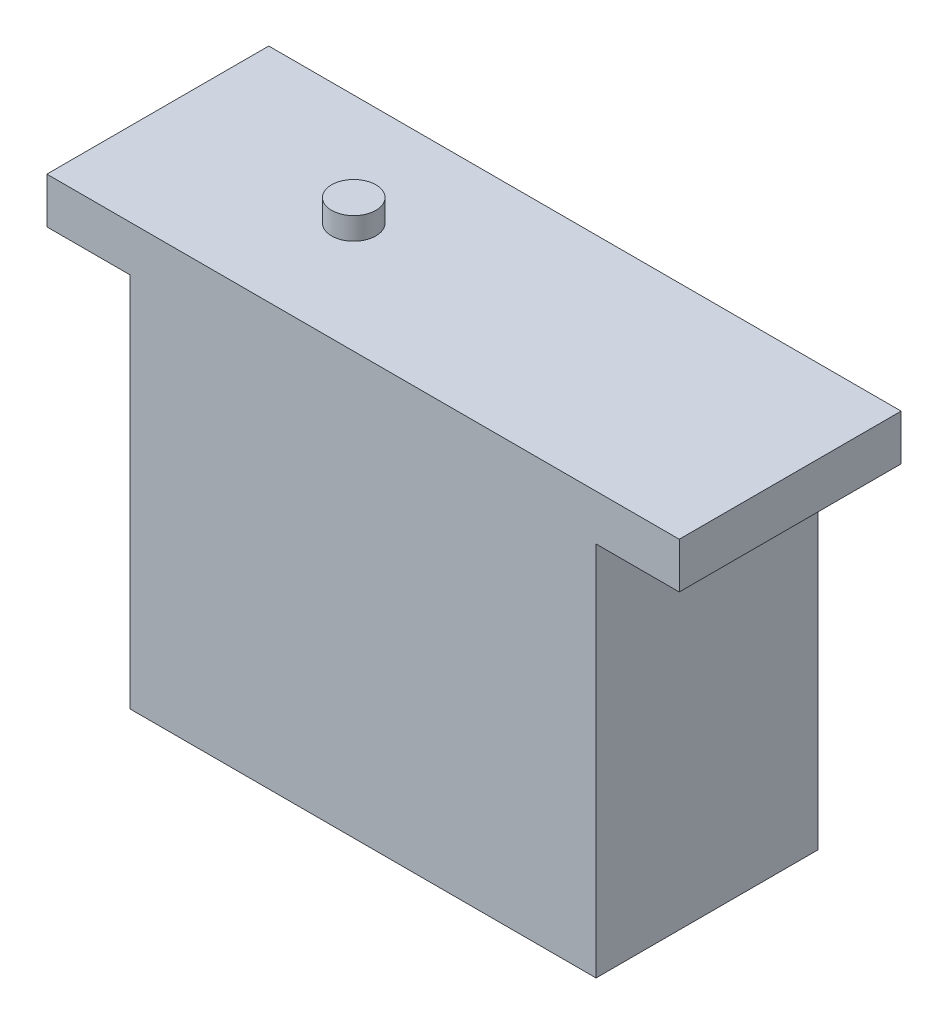
ISO-10303-21;
HEADER;
FILE_DESCRIPTION(('STEP AP214'),'2;1');
FILE_NAME('part.step','',(''),(''),'','','');
FILE_SCHEMA(('AUTOMOTIVE_DESIGN { 1 0 10303 214 1 1 1 1 }'));
ENDSEC;
DATA;
#1=APPLICATION_CONTEXT('core data for automotive mechanical design processes');
#2=APPLICATION_PROTOCOL_DEFINITION('international standard','automotive_design',2000,#1);
#3=PRODUCT_CONTEXT('',#1,'mechanical');
#4=PRODUCT('Part','Part','',(#3));
#5=PRODUCT_RELATED_PRODUCT_CATEGORY('part','',(#4));
#6=PRODUCT_DEFINITION_FORMATION('','',#4);
#7=PRODUCT_DEFINITION_CONTEXT('part definition',#1,'design');
#8=PRODUCT_DEFINITION('design','',#6,#7);
#9=PRODUCT_DEFINITION_SHAPE('','',#8);
#10=(LENGTH_UNIT() NAMED_UNIT(*) SI_UNIT(.MILLI.,.METRE.));
#11=(NAMED_UNIT(*) PLANE_ANGLE_UNIT() SI_UNIT($,.RADIAN.));
#12=(NAMED_UNIT(*) SI_UNIT($,.STERADIAN.) SOLID_ANGLE_UNIT());
#13=UNCERTAINTY_MEASURE_WITH_UNIT(LENGTH_MEASURE(1.E-05),#10,'distance_accuracy_value','');
#14=(GEOMETRIC_REPRESENTATION_CONTEXT(3) GLOBAL_UNCERTAINTY_ASSIGNED_CONTEXT((#13)) GLOBAL_UNIT_ASSIGNED_CONTEXT((#10,
#11,#12)) REPRESENTATION_CONTEXT('',''));
#15=CARTESIAN_POINT('',(0.,0.,0.));
#16=DIRECTION('',(0.,0.,1.));
#17=DIRECTION('',(1.,0.,0.));
#18=AXIS2_PLACEMENT_3D('',#15,#16,#17);
#19=CARTESIAN_POINT('',(-21.,19.,20.));
#20=DIRECTION('',(0.,1.,0.));
#21=DIRECTION('',(0.,0.,1.));
#22=AXIS2_PLACEMENT_3D('',#19,#20,#21);
#23=PLANE('',#22);
#24=CARTESIAN_POINT('',(-10.84,19.,10.));
#25=DIRECTION('',(0.,1.,0.));
#26=DIRECTION('',(0.,0.,1.));
#27=AXIS2_PLACEMENT_3D('',#24,#25,#26);
#28=CIRCLE('',#27,1.99591471340259);
#29=CARTESIAN_POINT('',(-10.84,19.,11.9959147134026));
#30=VERTEX_POINT('',#29);
#31=EDGE_CURVE('E162',#30,#30,#28,.T.);
#32=ORIENTED_EDGE('',*,*,#31,.F.);
#33=EDGE_LOOP('',(#32));
#34=FACE_BOUND('',#33,.T.);
#35=DIRECTION('',(1.,0.,0.));
#36=VECTOR('',#35,1.);
#37=CARTESIAN_POINT('',(-21.,19.,0.));
#38=LINE('',#37,#36);
#39=CARTESIAN_POINT('',(-28.5,19.,0.));
#40=VERTEX_POINT('',#39);
#41=CARTESIAN_POINT('',(28.5,19.,0.));
#42=VERTEX_POINT('',#41);
#43=EDGE_CURVE('E167',#40,#42,#38,.T.);
#44=ORIENTED_EDGE('',*,*,#43,.F.);
#45=DIRECTION('',(0.,0.,-1.));
#46=VECTOR('',#45,1.);
#47=CARTESIAN_POINT('',(-28.5,19.,20.));
#48=LINE('',#47,#46);
#49=CARTESIAN_POINT('',(-28.5,19.,20.));
#50=VERTEX_POINT('',#49);
#51=EDGE_CURVE('E142',#50,#40,#48,.T.);
#52=ORIENTED_EDGE('',*,*,#51,.F.);
#53=DIRECTION('',(1.,0.,0.));
#54=VECTOR('',#53,1.);
#55=CARTESIAN_POINT('',(-21.,19.,20.));
#56=LINE('',#55,#54);
#57=CARTESIAN_POINT('',(28.5,19.,20.));
#58=VERTEX_POINT('',#57);
#59=EDGE_CURVE('E171',#50,#58,#56,.T.);
#60=ORIENTED_EDGE('',*,*,#59,.T.);
#61=DIRECTION('',(0.,0.,-1.));
#62=VECTOR('',#61,1.);
#63=CARTESIAN_POINT('',(28.5,19.,20.));
#64=LINE('',#63,#62);
#65=EDGE_CURVE('E121',#58,#42,#64,.T.);
#66=ORIENTED_EDGE('',*,*,#65,.T.);
#67=EDGE_LOOP('',(#44,#52,#60,#66));
#68=FACE_BOUND('',#67,.T.);
#69=ADVANCED_FACE('F39',(#34,#68),#23,.T.);
#70=CARTESIAN_POINT('',(-21.,-19.,20.));
#71=DIRECTION('',(-1.,0.,0.));
#72=DIRECTION('',(0.,0.,1.));
#73=AXIS2_PLACEMENT_3D('',#70,#71,#72);
#74=PLANE('',#73);
#75=DIRECTION('',(0.,0.,1.));
#76=VECTOR('',#75,1.);
#77=CARTESIAN_POINT('',(-21.,14.8814159292037,20.));
#78=LINE('',#77,#76);
#79=CARTESIAN_POINT('',(-21.,14.8814159292037,0.));
#80=VERTEX_POINT('',#79);
#81=CARTESIAN_POINT('',(-21.,14.8814159292037,20.));
#82=VERTEX_POINT('',#81);
#83=EDGE_CURVE('E62',#80,#82,#78,.T.);
#84=ORIENTED_EDGE('',*,*,#83,.F.);
#85=DIRECTION('',(0.,1.,0.));
#86=VECTOR('',#85,1.);
#87=CARTESIAN_POINT('',(-21.,-19.,0.));
#88=LINE('',#87,#86);
#89=CARTESIAN_POINT('',(-21.,-19.,0.));
#90=VERTEX_POINT('',#89);
#91=EDGE_CURVE('E174',#90,#80,#88,.T.);
#92=ORIENTED_EDGE('',*,*,#91,.F.);
#93=DIRECTION('',(0.,0.,-1.));
#94=VECTOR('',#93,1.);
#95=CARTESIAN_POINT('',(-21.,-19.,20.));
#96=LINE('',#95,#94);
#97=CARTESIAN_POINT('',(-21.,-19.,20.));
#98=VERTEX_POINT('',#97);
#99=EDGE_CURVE('E11',#98,#90,#96,.T.);
#100=ORIENTED_EDGE('',*,*,#99,.F.);
#101=DIRECTION('',(0.,1.,0.));
#102=VECTOR('',#101,1.);
#103=CARTESIAN_POINT('',(-21.,-19.,20.));
#104=LINE('',#103,#102);
#105=EDGE_CURVE('E180',#98,#82,#104,.T.);
#106=ORIENTED_EDGE('',*,*,#105,.T.);
#107=EDGE_LOOP('',(#84,#92,#100,#106));
#108=FACE_BOUND('',#107,.T.);
#109=ADVANCED_FACE('F211',(#108),#74,.T.);
#110=CARTESIAN_POINT('',(-21.,-19.,20.));
#111=DIRECTION('',(0.,1.,0.));
#112=DIRECTION('',(0.,0.,1.));
#113=AXIS2_PLACEMENT_3D('',#110,#111,#112);
#114=PLANE('',#113);
#115=DIRECTION('',(1.,0.,0.));
#116=VECTOR('',#115,1.);
#117=CARTESIAN_POINT('',(-21.,-19.,0.));
#118=LINE('',#117,#116);
#119=CARTESIAN_POINT('',(21.,-19.,0.));
#120=VERTEX_POINT('',#119);
#121=EDGE_CURVE('E189',#90,#120,#118,.T.);
#122=ORIENTED_EDGE('',*,*,#121,.T.);
#123=DIRECTION('',(0.,0.,-1.));
#124=VECTOR('',#123,1.);
#125=CARTESIAN_POINT('',(21.,-19.,20.));
#126=LINE('',#125,#124);
#127=CARTESIAN_POINT('',(21.,-19.,20.));
#128=VERTEX_POINT('',#127);
#129=EDGE_CURVE('E42',#128,#120,#126,.T.);
#130=ORIENTED_EDGE('',*,*,#129,.F.);
#131=DIRECTION('',(1.,0.,0.));
#132=VECTOR('',#131,1.);
#133=CARTESIAN_POINT('',(-21.,-19.,20.));
#134=LINE('',#133,#132);
#135=EDGE_CURVE('E177',#98,#128,#134,.T.);
#136=ORIENTED_EDGE('',*,*,#135,.F.);
#137=ORIENTED_EDGE('',*,*,#99,.T.);
#138=EDGE_LOOP('',(#122,#130,#136,#137));
#139=FACE_BOUND('',#138,.T.);
#140=ADVANCED_FACE('F213',(#139),#114,.F.);
#141=CARTESIAN_POINT('',(21.,-19.,20.));
#142=DIRECTION('',(-1.,0.,0.));
#143=DIRECTION('',(0.,0.,1.));
#144=AXIS2_PLACEMENT_3D('',#141,#142,#143);
#145=PLANE('',#144);
#146=DIRECTION('',(0.,1.,0.));
#147=VECTOR('',#146,1.);
#148=CARTESIAN_POINT('',(21.,-19.,0.));
#149=LINE('',#148,#147);
#150=CARTESIAN_POINT('',(21.,14.8814159292037,0.));
#151=VERTEX_POINT('',#150);
#152=EDGE_CURVE('E185',#120,#151,#149,.T.);
#153=ORIENTED_EDGE('',*,*,#152,.T.);
#154=DIRECTION('',(0.,0.,1.));
#155=VECTOR('',#154,1.);
#156=CARTESIAN_POINT('',(21.,14.8814159292037,20.));
#157=LINE('',#156,#155);
#158=CARTESIAN_POINT('',(21.,14.8814159292037,20.));
#159=VERTEX_POINT('',#158);
#160=EDGE_CURVE('E123',#151,#159,#157,.T.);
#161=ORIENTED_EDGE('',*,*,#160,.T.);
#162=DIRECTION('',(0.,1.,0.));
#163=VECTOR('',#162,1.);
#164=CARTESIAN_POINT('',(21.,-19.,20.));
#165=LINE('',#164,#163);
#166=EDGE_CURVE('E110',#128,#159,#165,.T.);
#167=ORIENTED_EDGE('',*,*,#166,.F.);
#168=ORIENTED_EDGE('',*,*,#129,.T.);
#169=EDGE_LOOP('',(#153,#161,#167,#168));
#170=FACE_BOUND('',#169,.T.);
#171=ADVANCED_FACE('F217',(#170),#145,.F.);
#172=CARTESIAN_POINT('',(0.,0.,20.));
#173=DIRECTION('',(0.,0.,1.));
#174=DIRECTION('',(1.,0.,0.));
#175=AXIS2_PLACEMENT_3D('',#172,#173,#174);
#176=PLANE('',#175);
#177=ORIENTED_EDGE('',*,*,#59,.F.);
#178=DIRECTION('',(0.,1.,0.));
#179=VECTOR('',#178,1.);
#180=CARTESIAN_POINT('',(-28.5,19.,20.));
#181=LINE('',#180,#179);
#182=CARTESIAN_POINT('',(-28.5,14.8814159292037,20.));
#183=VERTEX_POINT('',#182);
#184=EDGE_CURVE('E138',#183,#50,#181,.T.);
#185=ORIENTED_EDGE('',*,*,#184,.F.);
#186=DIRECTION('',(1.,0.,0.));
#187=VECTOR('',#186,1.);
#188=CARTESIAN_POINT('',(-28.5,14.8814159292037,20.));
#189=LINE('',#188,#187);
#190=EDGE_CURVE('E152',#183,#82,#189,.T.);
#191=ORIENTED_EDGE('',*,*,#190,.T.);
#192=ORIENTED_EDGE('',*,*,#105,.F.);
#193=ORIENTED_EDGE('',*,*,#135,.T.);
#194=ORIENTED_EDGE('',*,*,#166,.T.);
#195=DIRECTION('',(-1.,0.,0.));
#196=VECTOR('',#195,1.);
#197=CARTESIAN_POINT('',(28.5,14.8814159292037,20.));
#198=LINE('',#197,#196);
#199=CARTESIAN_POINT('',(28.5,14.8814159292037,20.));
#200=VERTEX_POINT('',#199);
#201=EDGE_CURVE('E54',#200,#159,#198,.T.);
#202=ORIENTED_EDGE('',*,*,#201,.F.);
#203=DIRECTION('',(0.,1.,0.));
#204=VECTOR('',#203,1.);
#205=CARTESIAN_POINT('',(28.5,19.,20.));
#206=LINE('',#205,#204);
#207=EDGE_CURVE('E107',#200,#58,#206,.T.);
#208=ORIENTED_EDGE('',*,*,#207,.T.);
#209=EDGE_LOOP('',(#177,#185,#191,#192,#193,#194,#202,#208));
#210=FACE_BOUND('',#209,.T.);
#211=ADVANCED_FACE('F106',(#210),#176,.T.);
#212=CARTESIAN_POINT('',(0.,0.,0.));
#213=DIRECTION('',(0.,0.,1.));
#214=DIRECTION('',(1.,0.,0.));
#215=AXIS2_PLACEMENT_3D('',#212,#213,#214);
#216=PLANE('',#215);
#217=ORIENTED_EDGE('',*,*,#43,.T.);
#218=DIRECTION('',(0.,-1.,0.));
#219=VECTOR('',#218,1.);
#220=CARTESIAN_POINT('',(28.5,19.,0.));
#221=LINE('',#220,#219);
#222=CARTESIAN_POINT('',(28.5,14.8814159292037,0.));
#223=VERTEX_POINT('',#222);
#224=EDGE_CURVE('E127',#42,#223,#221,.T.);
#225=ORIENTED_EDGE('',*,*,#224,.T.);
#226=DIRECTION('',(-1.,0.,0.));
#227=VECTOR('',#226,1.);
#228=CARTESIAN_POINT('',(28.5,14.8814159292037,0.));
#229=LINE('',#228,#227);
#230=EDGE_CURVE('E112',#223,#151,#229,.T.);
#231=ORIENTED_EDGE('',*,*,#230,.T.);
#232=ORIENTED_EDGE('',*,*,#152,.F.);
#233=ORIENTED_EDGE('',*,*,#121,.F.);
#234=ORIENTED_EDGE('',*,*,#91,.T.);
#235=DIRECTION('',(1.,0.,0.));
#236=VECTOR('',#235,1.);
#237=CARTESIAN_POINT('',(-28.5,14.8814159292037,0.));
#238=LINE('',#237,#236);
#239=CARTESIAN_POINT('',(-28.5,14.8814159292037,0.));
#240=VERTEX_POINT('',#239);
#241=EDGE_CURVE('E158',#240,#80,#238,.T.);
#242=ORIENTED_EDGE('',*,*,#241,.F.);
#243=DIRECTION('',(0.,-1.,0.));
#244=VECTOR('',#243,1.);
#245=CARTESIAN_POINT('',(-28.5,19.,0.));
#246=LINE('',#245,#244);
#247=EDGE_CURVE('E146',#40,#240,#246,.T.);
#248=ORIENTED_EDGE('',*,*,#247,.F.);
#249=EDGE_LOOP('',(#217,#225,#231,#232,#233,#234,#242,#248));
#250=FACE_BOUND('',#249,.T.);
#251=ADVANCED_FACE('F196',(#250),#216,.F.);
#252=CARTESIAN_POINT('',(-10.84,21.,10.));
#253=DIRECTION('',(0.,-1.,0.));
#254=DIRECTION('',(0.,0.,-1.));
#255=AXIS2_PLACEMENT_3D('',#252,#253,#254);
#256=CYLINDRICAL_SURFACE('',#255,1.99591471340259);
#257=CARTESIAN_POINT('',(-10.84,21.,10.));
#258=DIRECTION('',(0.,1.,0.));
#259=DIRECTION('',(0.,0.,1.));
#260=AXIS2_PLACEMENT_3D('',#257,#258,#259);
#261=CIRCLE('',#260,1.99591471340259);
#262=CARTESIAN_POINT('',(-10.84,21.,11.9959147134026));
#263=VERTEX_POINT('',#262);
#264=EDGE_CURVE('E163',#263,#263,#261,.T.);
#265=ORIENTED_EDGE('',*,*,#264,.F.);
#266=EDGE_LOOP('',(#265));
#267=FACE_BOUND('',#266,.T.);
#268=ORIENTED_EDGE('',*,*,#31,.T.);
#269=EDGE_LOOP('',(#268));
#270=FACE_BOUND('',#269,.T.);
#271=ADVANCED_FACE('F233',(#267,#270),#256,.T.);
#272=CARTESIAN_POINT('',(-10.84,21.,10.));
#273=DIRECTION('',(0.,1.,0.));
#274=DIRECTION('',(0.,0.,1.));
#275=AXIS2_PLACEMENT_3D('',#272,#273,#274);
#276=PLANE('',#275);
#277=ORIENTED_EDGE('',*,*,#264,.T.);
#278=EDGE_LOOP('',(#277));
#279=FACE_BOUND('',#278,.T.);
#280=ADVANCED_FACE('F235',(#279),#276,.T.);
#281=CARTESIAN_POINT('',(-28.5,14.8814159292037,20.));
#282=DIRECTION('',(0.,1.,0.));
#283=DIRECTION('',(0.,0.,1.));
#284=AXIS2_PLACEMENT_3D('',#281,#282,#283);
#285=PLANE('',#284);
#286=ORIENTED_EDGE('',*,*,#83,.T.);
#287=ORIENTED_EDGE('',*,*,#190,.F.);
#288=DIRECTION('',(0.,0.,1.));
#289=VECTOR('',#288,1.);
#290=CARTESIAN_POINT('',(-28.5,14.8814159292037,20.));
#291=LINE('',#290,#289);
#292=EDGE_CURVE('E149',#240,#183,#291,.T.);
#293=ORIENTED_EDGE('',*,*,#292,.F.);
#294=ORIENTED_EDGE('',*,*,#241,.T.);
#295=EDGE_LOOP('',(#286,#287,#293,#294));
#296=FACE_BOUND('',#295,.T.);
#297=ADVANCED_FACE('F201',(#296),#285,.F.);
#298=CARTESIAN_POINT('',(-28.5,0.,0.));
#299=DIRECTION('',(1.,0.,0.));
#300=DIRECTION('',(0.,0.,-1.));
#301=AXIS2_PLACEMENT_3D('',#298,#299,#300);
#302=PLANE('',#301);
#303=ORIENTED_EDGE('',*,*,#184,.T.);
#304=ORIENTED_EDGE('',*,*,#51,.T.);
#305=ORIENTED_EDGE('',*,*,#247,.T.);
#306=ORIENTED_EDGE('',*,*,#292,.T.);
#307=EDGE_LOOP('',(#303,#304,#305,#306));
#308=FACE_BOUND('',#307,.T.);
#309=ADVANCED_FACE('F205',(#308),#302,.F.);
#310=CARTESIAN_POINT('',(28.5,14.8814159292037,20.));
#311=DIRECTION('',(0.,-1.,0.));
#312=DIRECTION('',(0.,0.,-1.));
#313=AXIS2_PLACEMENT_3D('',#310,#311,#312);
#314=PLANE('',#313);
#315=ORIENTED_EDGE('',*,*,#160,.F.);
#316=ORIENTED_EDGE('',*,*,#230,.F.);
#317=DIRECTION('',(0.,0.,1.));
#318=VECTOR('',#317,1.);
#319=CARTESIAN_POINT('',(28.5,14.8814159292037,20.));
#320=LINE('',#319,#318);
#321=EDGE_CURVE('E118',#223,#200,#320,.T.);
#322=ORIENTED_EDGE('',*,*,#321,.T.);
#323=ORIENTED_EDGE('',*,*,#201,.T.);
#324=EDGE_LOOP('',(#315,#316,#322,#323));
#325=FACE_BOUND('',#324,.T.);
#326=ADVANCED_FACE('F125',(#325),#314,.T.);
#327=CARTESIAN_POINT('',(28.5,0.,0.));
#328=DIRECTION('',(-1.,0.,0.));
#329=DIRECTION('',(0.,0.,-1.));
#330=AXIS2_PLACEMENT_3D('',#327,#328,#329);
#331=PLANE('',#330);
#332=ORIENTED_EDGE('',*,*,#207,.F.);
#333=ORIENTED_EDGE('',*,*,#321,.F.);
#334=ORIENTED_EDGE('',*,*,#224,.F.);
#335=ORIENTED_EDGE('',*,*,#65,.F.);
#336=EDGE_LOOP('',(#332,#333,#334,#335));
#337=FACE_BOUND('',#336,.T.);
#338=ADVANCED_FACE('F116',(#337),#331,.F.);
#339=CLOSED_SHELL('',(#69,#109,#140,#171,#211,#251,#271,#280,#297,#309,#326,#338));
#340=MANIFOLD_SOLID_BREP('B2',#339);
#341=ADVANCED_BREP_SHAPE_REPRESENTATION('',(#18,#340),#14);
#342=SHAPE_DEFINITION_REPRESENTATION(#9,#341);
ENDSEC;
END-ISO-10303-21;
